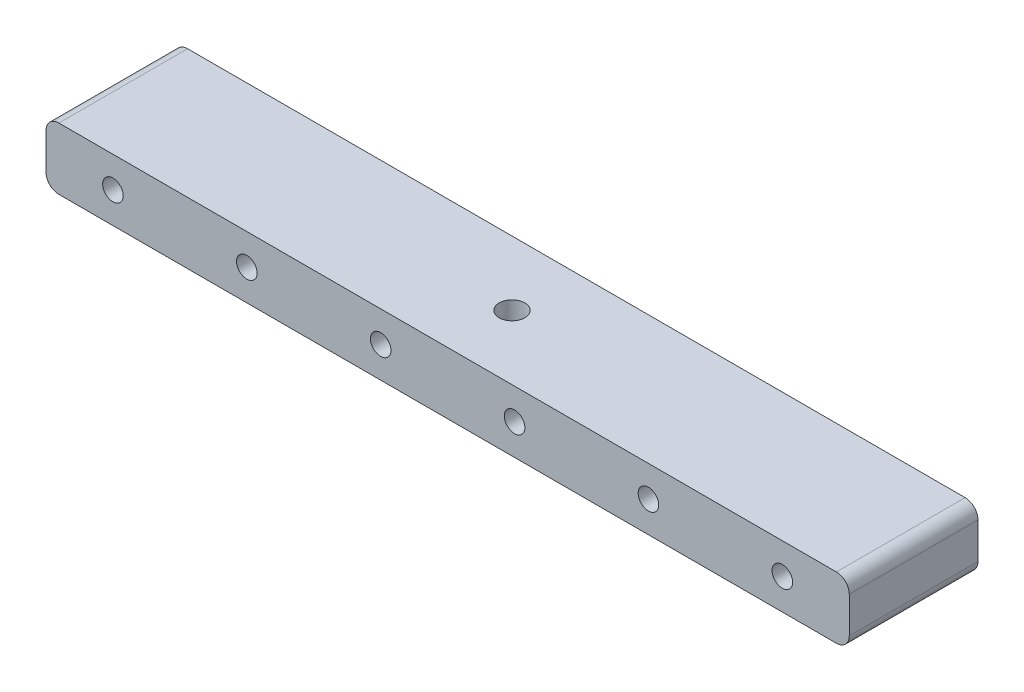
ISO-10303-21;
HEADER;
FILE_DESCRIPTION(('STEP AP214'),'2;1');
FILE_NAME('part.step','',(''),(''),'','','');
FILE_SCHEMA(('AUTOMOTIVE_DESIGN { 1 0 10303 214 1 1 1 1 }'));
ENDSEC;
DATA;
#1=APPLICATION_CONTEXT('core data for automotive mechanical design processes');
#2=APPLICATION_PROTOCOL_DEFINITION('international standard','automotive_design',2000,#1);
#3=PRODUCT_CONTEXT('',#1,'mechanical');
#4=PRODUCT('Part','Part','',(#3));
#5=PRODUCT_RELATED_PRODUCT_CATEGORY('part','',(#4));
#6=PRODUCT_DEFINITION_FORMATION('','',#4);
#7=PRODUCT_DEFINITION_CONTEXT('part definition',#1,'design');
#8=PRODUCT_DEFINITION('design','',#6,#7);
#9=PRODUCT_DEFINITION_SHAPE('','',#8);
#10=(LENGTH_UNIT() NAMED_UNIT(*) SI_UNIT(.MILLI.,.METRE.));
#11=(NAMED_UNIT(*) PLANE_ANGLE_UNIT() SI_UNIT($,.RADIAN.));
#12=(NAMED_UNIT(*) SI_UNIT($,.STERADIAN.) SOLID_ANGLE_UNIT());
#13=UNCERTAINTY_MEASURE_WITH_UNIT(LENGTH_MEASURE(1.E-05),#10,'distance_accuracy_value','');
#14=(GEOMETRIC_REPRESENTATION_CONTEXT(3) GLOBAL_UNCERTAINTY_ASSIGNED_CONTEXT((#13)) GLOBAL_UNIT_ASSIGNED_CONTEXT((#10,
#11,#12)) REPRESENTATION_CONTEXT('',''));
#15=CARTESIAN_POINT('',(0.,0.,0.));
#16=DIRECTION('',(0.,0.,1.));
#17=DIRECTION('',(1.,0.,0.));
#18=AXIS2_PLACEMENT_3D('',#15,#16,#17);
#19=CARTESIAN_POINT('',(65.,0.,2.5));
#20=DIRECTION('',(0.,0.,1.));
#21=DIRECTION('',(1.,0.,0.));
#22=AXIS2_PLACEMENT_3D('',#19,#20,#21);
#23=PLANE('',#22);
#24=CARTESIAN_POINT('',(65.,0.,2.5));
#25=DIRECTION('',(0.,0.,1.));
#26=DIRECTION('',(1.,0.,0.));
#27=AXIS2_PLACEMENT_3D('',#24,#25,#26);
#28=CIRCLE('',#27,2.);
#29=CARTESIAN_POINT('',(67.,0.,2.5));
#30=VERTEX_POINT('',#29);
#31=EDGE_CURVE('E11',#30,#30,#28,.T.);
#32=ORIENTED_EDGE('',*,*,#31,.T.);
#33=EDGE_LOOP('',(#32));
#34=FACE_BOUND('',#33,.T.);
#35=ADVANCED_FACE('F37',(#34),#23,.T.);
#36=CARTESIAN_POINT('',(65.,0.,2.5));
#37=DIRECTION('',(0.,0.,1.));
#38=DIRECTION('',(1.,0.,0.));
#39=AXIS2_PLACEMENT_3D('',#36,#37,#38);
#40=CYLINDRICAL_SURFACE('',#39,2.);
#41=ORIENTED_EDGE('',*,*,#31,.F.);
#42=EDGE_LOOP('',(#41));
#43=FACE_BOUND('',#42,.T.);
#44=CARTESIAN_POINT('',(65.,0.,12.5));
#45=DIRECTION('',(0.,0.,1.));
#46=DIRECTION('',(1.,0.,0.));
#47=AXIS2_PLACEMENT_3D('',#44,#45,#46);
#48=CIRCLE('',#47,2.);
#49=CARTESIAN_POINT('',(67.,0.,12.5));
#50=VERTEX_POINT('',#49);
#51=EDGE_CURVE('E44',#50,#50,#48,.T.);
#52=ORIENTED_EDGE('',*,*,#51,.T.);
#53=EDGE_LOOP('',(#52));
#54=FACE_BOUND('',#53,.T.);
#55=ADVANCED_FACE('F179',(#43,#54),#40,.F.);
#56=CARTESIAN_POINT('',(39.,0.,2.5));
#57=DIRECTION('',(0.,0.,1.));
#58=DIRECTION('',(1.,0.,0.));
#59=AXIS2_PLACEMENT_3D('',#56,#57,#58);
#60=PLANE('',#59);
#61=CARTESIAN_POINT('',(39.,0.,2.5));
#62=DIRECTION('',(0.,0.,1.));
#63=DIRECTION('',(1.,0.,0.));
#64=AXIS2_PLACEMENT_3D('',#61,#62,#63);
#65=CIRCLE('',#64,2.);
#66=CARTESIAN_POINT('',(41.,0.,2.5));
#67=VERTEX_POINT('',#66);
#68=EDGE_CURVE('E174',#67,#67,#65,.T.);
#69=ORIENTED_EDGE('',*,*,#68,.T.);
#70=EDGE_LOOP('',(#69));
#71=FACE_BOUND('',#70,.T.);
#72=ADVANCED_FACE('F202',(#71),#60,.T.);
#73=CARTESIAN_POINT('',(39.,0.,2.5));
#74=DIRECTION('',(0.,0.,1.));
#75=DIRECTION('',(1.,0.,0.));
#76=AXIS2_PLACEMENT_3D('',#73,#74,#75);
#77=CYLINDRICAL_SURFACE('',#76,2.);
#78=ORIENTED_EDGE('',*,*,#68,.F.);
#79=EDGE_LOOP('',(#78));
#80=FACE_BOUND('',#79,.T.);
#81=CARTESIAN_POINT('',(39.,0.,12.5));
#82=DIRECTION('',(0.,0.,1.));
#83=DIRECTION('',(1.,0.,0.));
#84=AXIS2_PLACEMENT_3D('',#81,#82,#83);
#85=CIRCLE('',#84,2.);
#86=CARTESIAN_POINT('',(41.,0.,12.5));
#87=VERTEX_POINT('',#86);
#88=EDGE_CURVE('E171',#87,#87,#85,.T.);
#89=ORIENTED_EDGE('',*,*,#88,.T.);
#90=EDGE_LOOP('',(#89));
#91=FACE_BOUND('',#90,.T.);
#92=ADVANCED_FACE('F208',(#80,#91),#77,.F.);
#93=CARTESIAN_POINT('',(13.,0.,2.5));
#94=DIRECTION('',(0.,0.,1.));
#95=DIRECTION('',(1.,0.,0.));
#96=AXIS2_PLACEMENT_3D('',#93,#94,#95);
#97=PLANE('',#96);
#98=CARTESIAN_POINT('',(13.,0.,2.5));
#99=DIRECTION('',(0.,0.,1.));
#100=DIRECTION('',(1.,0.,0.));
#101=AXIS2_PLACEMENT_3D('',#98,#99,#100);
#102=CIRCLE('',#101,2.);
#103=CARTESIAN_POINT('',(15.,0.,2.5));
#104=VERTEX_POINT('',#103);
#105=EDGE_CURVE('E168',#104,#104,#102,.T.);
#106=ORIENTED_EDGE('',*,*,#105,.T.);
#107=EDGE_LOOP('',(#106));
#108=FACE_BOUND('',#107,.T.);
#109=ADVANCED_FACE('F214',(#108),#97,.T.);
#110=CARTESIAN_POINT('',(13.,0.,2.5));
#111=DIRECTION('',(0.,0.,1.));
#112=DIRECTION('',(1.,0.,0.));
#113=AXIS2_PLACEMENT_3D('',#110,#111,#112);
#114=CYLINDRICAL_SURFACE('',#113,2.);
#115=ORIENTED_EDGE('',*,*,#105,.F.);
#116=EDGE_LOOP('',(#115));
#117=FACE_BOUND('',#116,.T.);
#118=CARTESIAN_POINT('',(13.,0.,12.5));
#119=DIRECTION('',(0.,0.,1.));
#120=DIRECTION('',(1.,0.,0.));
#121=AXIS2_PLACEMENT_3D('',#118,#119,#120);
#122=CIRCLE('',#121,2.);
#123=CARTESIAN_POINT('',(15.,0.,12.5));
#124=VERTEX_POINT('',#123);
#125=EDGE_CURVE('E165',#124,#124,#122,.T.);
#126=ORIENTED_EDGE('',*,*,#125,.T.);
#127=EDGE_LOOP('',(#126));
#128=FACE_BOUND('',#127,.T.);
#129=ADVANCED_FACE('F218',(#117,#128),#114,.F.);
#130=CARTESIAN_POINT('',(-13.,0.,2.5));
#131=DIRECTION('',(0.,0.,1.));
#132=DIRECTION('',(1.,0.,0.));
#133=AXIS2_PLACEMENT_3D('',#130,#131,#132);
#134=PLANE('',#133);
#135=CARTESIAN_POINT('',(-13.,0.,2.5));
#136=DIRECTION('',(0.,0.,1.));
#137=DIRECTION('',(1.,0.,0.));
#138=AXIS2_PLACEMENT_3D('',#135,#136,#137);
#139=CIRCLE('',#138,2.);
#140=CARTESIAN_POINT('',(-11.,0.,2.5));
#141=VERTEX_POINT('',#140);
#142=EDGE_CURVE('E162',#141,#141,#139,.T.);
#143=ORIENTED_EDGE('',*,*,#142,.T.);
#144=EDGE_LOOP('',(#143));
#145=FACE_BOUND('',#144,.T.);
#146=ADVANCED_FACE('F222',(#145),#134,.T.);
#147=CARTESIAN_POINT('',(-13.,0.,2.5));
#148=DIRECTION('',(0.,0.,1.));
#149=DIRECTION('',(1.,0.,0.));
#150=AXIS2_PLACEMENT_3D('',#147,#148,#149);
#151=CYLINDRICAL_SURFACE('',#150,2.);
#152=ORIENTED_EDGE('',*,*,#142,.F.);
#153=EDGE_LOOP('',(#152));
#154=FACE_BOUND('',#153,.T.);
#155=CARTESIAN_POINT('',(-13.,0.,12.5));
#156=DIRECTION('',(0.,0.,1.));
#157=DIRECTION('',(1.,0.,0.));
#158=AXIS2_PLACEMENT_3D('',#155,#156,#157);
#159=CIRCLE('',#158,2.);
#160=CARTESIAN_POINT('',(-11.,0.,12.5));
#161=VERTEX_POINT('',#160);
#162=EDGE_CURVE('E159',#161,#161,#159,.T.);
#163=ORIENTED_EDGE('',*,*,#162,.T.);
#164=EDGE_LOOP('',(#163));
#165=FACE_BOUND('',#164,.T.);
#166=ADVANCED_FACE('F226',(#154,#165),#151,.F.);
#167=CARTESIAN_POINT('',(0.,6.,0.));
#168=DIRECTION('',(0.,1.,0.));
#169=DIRECTION('',(0.,0.,1.));
#170=AXIS2_PLACEMENT_3D('',#167,#168,#169);
#171=PLANE('',#170);
#172=DIRECTION('',(-1.,0.,0.));
#173=VECTOR('',#172,1.);
#174=CARTESIAN_POINT('',(-78.,6.,-12.5));
#175=LINE('',#174,#173);
#176=CARTESIAN_POINT('',(75.5,6.,-12.5));
#177=VERTEX_POINT('',#176);
#178=CARTESIAN_POINT('',(-75.5,6.,-12.5));
#179=VERTEX_POINT('',#178);
#180=EDGE_CURVE('E290',#177,#179,#175,.T.);
#181=ORIENTED_EDGE('',*,*,#180,.T.);
#182=DIRECTION('',(0.,0.,1.));
#183=VECTOR('',#182,1.);
#184=CARTESIAN_POINT('',(-75.5,6.,12.5));
#185=LINE('',#184,#183);
#186=CARTESIAN_POINT('',(-75.5,6.,12.5));
#187=VERTEX_POINT('',#186);
#188=EDGE_CURVE('E153',#179,#187,#185,.T.);
#189=ORIENTED_EDGE('',*,*,#188,.T.);
#190=DIRECTION('',(1.,0.,0.));
#191=VECTOR('',#190,1.);
#192=CARTESIAN_POINT('',(-78.,6.,12.5));
#193=LINE('',#192,#191);
#194=CARTESIAN_POINT('',(75.5,6.,12.5));
#195=VERTEX_POINT('',#194);
#196=EDGE_CURVE('E109',#187,#195,#193,.T.);
#197=ORIENTED_EDGE('',*,*,#196,.T.);
#198=DIRECTION('',(0.,0.,-1.));
#199=VECTOR('',#198,1.);
#200=CARTESIAN_POINT('',(75.5,6.,-12.5));
#201=LINE('',#200,#199);
#202=EDGE_CURVE('E150',#195,#177,#201,.T.);
#203=ORIENTED_EDGE('',*,*,#202,.T.);
#204=EDGE_LOOP('',(#181,#189,#197,#203));
#205=FACE_BOUND('',#204,.T.);
#206=CARTESIAN_POINT('',(0.,6.,0.));
#207=DIRECTION('',(0.,1.,0.));
#208=DIRECTION('',(0.,0.,1.));
#209=AXIS2_PLACEMENT_3D('',#206,#207,#208);
#210=CIRCLE('',#209,2.5);
#211=CARTESIAN_POINT('',(0.,6.,2.5));
#212=VERTEX_POINT('',#211);
#213=EDGE_CURVE('E283',#212,#212,#210,.T.);
#214=ORIENTED_EDGE('',*,*,#213,.F.);
#215=EDGE_LOOP('',(#214));
#216=FACE_BOUND('',#215,.T.);
#217=ADVANCED_FACE('F230',(#205,#216),#171,.T.);
#218=CARTESIAN_POINT('',(0.,-6.,0.));
#219=DIRECTION('',(0.,1.,0.));
#220=DIRECTION('',(0.,0.,1.));
#221=AXIS2_PLACEMENT_3D('',#218,#219,#220);
#222=PLANE('',#221);
#223=DIRECTION('',(1.,0.,0.));
#224=VECTOR('',#223,1.);
#225=CARTESIAN_POINT('',(-78.,-6.,12.5));
#226=LINE('',#225,#224);
#227=CARTESIAN_POINT('',(-75.5,-6.,12.5));
#228=VERTEX_POINT('',#227);
#229=CARTESIAN_POINT('',(75.5,-6.,12.5));
#230=VERTEX_POINT('',#229);
#231=EDGE_CURVE('E282',#228,#230,#226,.T.);
#232=ORIENTED_EDGE('',*,*,#231,.F.);
#233=DIRECTION('',(0.,0.,1.));
#234=VECTOR('',#233,1.);
#235=CARTESIAN_POINT('',(-75.5,-6.,0.));
#236=LINE('',#235,#234);
#237=CARTESIAN_POINT('',(-75.5,-6.,-12.5));
#238=VERTEX_POINT('',#237);
#239=EDGE_CURVE('E143',#228,#238,#236,.F.);
#240=ORIENTED_EDGE('',*,*,#239,.T.);
#241=DIRECTION('',(-1.,0.,0.));
#242=VECTOR('',#241,1.);
#243=CARTESIAN_POINT('',(-78.,-6.,-12.5));
#244=LINE('',#243,#242);
#245=CARTESIAN_POINT('',(75.5,-6.,-12.5));
#246=VERTEX_POINT('',#245);
#247=EDGE_CURVE('E279',#246,#238,#244,.T.);
#248=ORIENTED_EDGE('',*,*,#247,.F.);
#249=DIRECTION('',(0.,0.,-1.));
#250=VECTOR('',#249,1.);
#251=CARTESIAN_POINT('',(75.5,-6.,0.));
#252=LINE('',#251,#250);
#253=EDGE_CURVE('E141',#246,#230,#252,.F.);
#254=ORIENTED_EDGE('',*,*,#253,.T.);
#255=EDGE_LOOP('',(#232,#240,#248,#254));
#256=FACE_BOUND('',#255,.T.);
#257=CARTESIAN_POINT('',(0.,-6.,0.));
#258=DIRECTION('',(0.,1.,0.));
#259=DIRECTION('',(0.,0.,1.));
#260=AXIS2_PLACEMENT_3D('',#257,#258,#259);
#261=CIRCLE('',#260,2.5);
#262=CARTESIAN_POINT('',(0.,-6.,2.5));
#263=VERTEX_POINT('',#262);
#264=EDGE_CURVE('E304',#263,#263,#261,.T.);
#265=ORIENTED_EDGE('',*,*,#264,.T.);
#266=EDGE_LOOP('',(#265));
#267=FACE_BOUND('',#266,.T.);
#268=ADVANCED_FACE('F248',(#256,#267),#222,.F.);
#269=CARTESIAN_POINT('',(78.,6.,-12.5));
#270=DIRECTION('',(-1.,0.,0.));
#271=DIRECTION('',(0.,0.,1.));
#272=AXIS2_PLACEMENT_3D('',#269,#270,#271);
#273=PLANE('',#272);
#274=DIRECTION('',(0.,-1.,0.));
#275=VECTOR('',#274,1.);
#276=CARTESIAN_POINT('',(78.,6.,12.5));
#277=LINE('',#276,#275);
#278=CARTESIAN_POINT('',(78.,3.5,12.5));
#279=VERTEX_POINT('',#278);
#280=CARTESIAN_POINT('',(78.,-3.5,12.5));
#281=VERTEX_POINT('',#280);
#282=EDGE_CURVE('E126',#279,#281,#277,.T.);
#283=ORIENTED_EDGE('',*,*,#282,.T.);
#284=DIRECTION('',(0.,0.,-1.));
#285=VECTOR('',#284,1.);
#286=CARTESIAN_POINT('',(78.,-3.5,-12.5));
#287=LINE('',#286,#285);
#288=CARTESIAN_POINT('',(78.,-3.5,-12.5));
#289=VERTEX_POINT('',#288);
#290=EDGE_CURVE('E157',#281,#289,#287,.T.);
#291=ORIENTED_EDGE('',*,*,#290,.T.);
#292=DIRECTION('',(0.,-1.,0.));
#293=VECTOR('',#292,1.);
#294=CARTESIAN_POINT('',(78.,6.,-12.5));
#295=LINE('',#294,#293);
#296=CARTESIAN_POINT('',(78.,3.5,-12.5));
#297=VERTEX_POINT('',#296);
#298=EDGE_CURVE('E131',#297,#289,#295,.T.);
#299=ORIENTED_EDGE('',*,*,#298,.F.);
#300=DIRECTION('',(0.,0.,-1.));
#301=VECTOR('',#300,1.);
#302=CARTESIAN_POINT('',(78.,3.5,12.5));
#303=LINE('',#302,#301);
#304=EDGE_CURVE('E155',#297,#279,#303,.F.);
#305=ORIENTED_EDGE('',*,*,#304,.T.);
#306=EDGE_LOOP('',(#283,#291,#299,#305));
#307=FACE_BOUND('',#306,.T.);
#308=ADVANCED_FACE('F245',(#307),#273,.F.);
#309=CARTESIAN_POINT('',(-78.,6.,-12.5));
#310=DIRECTION('',(0.,0.,1.));
#311=DIRECTION('',(1.,0.,0.));
#312=AXIS2_PLACEMENT_3D('',#309,#310,#311);
#313=PLANE('',#312);
#314=CARTESIAN_POINT('',(-65.,0.,-12.5));
#315=DIRECTION('',(0.,0.,1.));
#316=DIRECTION('',(1.,0.,0.));
#317=AXIS2_PLACEMENT_3D('',#314,#315,#316);
#318=CIRCLE('',#317,2.);
#319=CARTESIAN_POINT('',(-63.,0.,-12.5));
#320=VERTEX_POINT('',#319);
#321=EDGE_CURVE('E257',#320,#320,#318,.T.);
#322=ORIENTED_EDGE('',*,*,#321,.T.);
#323=EDGE_LOOP('',(#322));
#324=FACE_BOUND('',#323,.T.);
#325=CARTESIAN_POINT('',(-39.,0.,-12.5));
#326=DIRECTION('',(0.,0.,1.));
#327=DIRECTION('',(1.,0.,0.));
#328=AXIS2_PLACEMENT_3D('',#325,#326,#327);
#329=CIRCLE('',#328,2.);
#330=CARTESIAN_POINT('',(-37.,0.,-12.5));
#331=VERTEX_POINT('',#330);
#332=EDGE_CURVE('E261',#331,#331,#329,.T.);
#333=ORIENTED_EDGE('',*,*,#332,.T.);
#334=EDGE_LOOP('',(#333));
#335=FACE_BOUND('',#334,.T.);
#336=CARTESIAN_POINT('',(-13.,0.,-12.5));
#337=DIRECTION('',(0.,0.,1.));
#338=DIRECTION('',(1.,0.,0.));
#339=AXIS2_PLACEMENT_3D('',#336,#337,#338);
#340=CIRCLE('',#339,2.);
#341=CARTESIAN_POINT('',(-11.,0.,-12.5));
#342=VERTEX_POINT('',#341);
#343=EDGE_CURVE('E265',#342,#342,#340,.T.);
#344=ORIENTED_EDGE('',*,*,#343,.T.);
#345=EDGE_LOOP('',(#344));
#346=FACE_BOUND('',#345,.T.);
#347=CARTESIAN_POINT('',(13.,0.,-12.5));
#348=DIRECTION('',(0.,0.,1.));
#349=DIRECTION('',(1.,0.,0.));
#350=AXIS2_PLACEMENT_3D('',#347,#348,#349);
#351=CIRCLE('',#350,2.);
#352=CARTESIAN_POINT('',(15.,0.,-12.5));
#353=VERTEX_POINT('',#352);
#354=EDGE_CURVE('E269',#353,#353,#351,.T.);
#355=ORIENTED_EDGE('',*,*,#354,.T.);
#356=EDGE_LOOP('',(#355));
#357=FACE_BOUND('',#356,.T.);
#358=CARTESIAN_POINT('',(39.,0.,-12.5));
#359=DIRECTION('',(0.,0.,1.));
#360=DIRECTION('',(1.,0.,0.));
#361=AXIS2_PLACEMENT_3D('',#358,#359,#360);
#362=CIRCLE('',#361,2.);
#363=CARTESIAN_POINT('',(41.,0.,-12.5));
#364=VERTEX_POINT('',#363);
#365=EDGE_CURVE('E273',#364,#364,#362,.T.);
#366=ORIENTED_EDGE('',*,*,#365,.T.);
#367=EDGE_LOOP('',(#366));
#368=FACE_BOUND('',#367,.T.);
#369=CARTESIAN_POINT('',(65.,0.,-12.5));
#370=DIRECTION('',(0.,0.,1.));
#371=DIRECTION('',(1.,0.,0.));
#372=AXIS2_PLACEMENT_3D('',#369,#370,#371);
#373=CIRCLE('',#372,2.);
#374=CARTESIAN_POINT('',(67.,0.,-12.5));
#375=VERTEX_POINT('',#374);
#376=EDGE_CURVE('E276',#375,#375,#373,.T.);
#377=ORIENTED_EDGE('',*,*,#376,.T.);
#378=EDGE_LOOP('',(#377));
#379=FACE_BOUND('',#378,.T.);
#380=ORIENTED_EDGE('',*,*,#247,.T.);
#381=CARTESIAN_POINT('',(-75.5,-3.5,-12.5));
#382=DIRECTION('',(0.,0.,1.));
#383=DIRECTION('',(1.,0.,0.));
#384=AXIS2_PLACEMENT_3D('',#381,#382,#383);
#385=CIRCLE('',#384,2.5);
#386=CARTESIAN_POINT('',(-78.,-3.5,-12.5));
#387=VERTEX_POINT('',#386);
#388=EDGE_CURVE('E148',#238,#387,#385,.F.);
#389=ORIENTED_EDGE('',*,*,#388,.T.);
#390=DIRECTION('',(0.,-1.,0.));
#391=VECTOR('',#390,1.);
#392=CARTESIAN_POINT('',(-78.,6.,-12.5));
#393=LINE('',#392,#391);
#394=CARTESIAN_POINT('',(-78.,3.5,-12.5));
#395=VERTEX_POINT('',#394);
#396=EDGE_CURVE('E125',#395,#387,#393,.T.);
#397=ORIENTED_EDGE('',*,*,#396,.F.);
#398=CARTESIAN_POINT('',(-75.5,3.5,-12.5));
#399=DIRECTION('',(0.,0.,1.));
#400=DIRECTION('',(1.,0.,0.));
#401=AXIS2_PLACEMENT_3D('',#398,#399,#400);
#402=CIRCLE('',#401,2.5);
#403=EDGE_CURVE('E130',#395,#179,#402,.F.);
#404=ORIENTED_EDGE('',*,*,#403,.T.);
#405=ORIENTED_EDGE('',*,*,#180,.F.);
#406=CARTESIAN_POINT('',(75.5,3.5,-12.5));
#407=DIRECTION('',(0.,0.,1.));
#408=DIRECTION('',(1.,0.,0.));
#409=AXIS2_PLACEMENT_3D('',#406,#407,#408);
#410=CIRCLE('',#409,2.5);
#411=EDGE_CURVE('E59',#177,#297,#410,.F.);
#412=ORIENTED_EDGE('',*,*,#411,.T.);
#413=ORIENTED_EDGE('',*,*,#298,.T.);
#414=CARTESIAN_POINT('',(75.5,-3.5,-12.5));
#415=DIRECTION('',(0.,0.,1.));
#416=DIRECTION('',(1.,0.,0.));
#417=AXIS2_PLACEMENT_3D('',#414,#415,#416);
#418=CIRCLE('',#417,2.5);
#419=EDGE_CURVE('E51',#289,#246,#418,.F.);
#420=ORIENTED_EDGE('',*,*,#419,.T.);
#421=EDGE_LOOP('',(#380,#389,#397,#404,#405,#412,#413,#420));
#422=FACE_BOUND('',#421,.T.);
#423=ADVANCED_FACE('F192',(#324,#335,#346,#357,#368,#379,#422),#313,.F.);
#424=CARTESIAN_POINT('',(-78.,6.,-12.5));
#425=DIRECTION('',(1.,0.,0.));
#426=DIRECTION('',(0.,0.,-1.));
#427=AXIS2_PLACEMENT_3D('',#424,#425,#426);
#428=PLANE('',#427);
#429=ORIENTED_EDGE('',*,*,#396,.T.);
#430=DIRECTION('',(0.,0.,1.));
#431=VECTOR('',#430,1.);
#432=CARTESIAN_POINT('',(-78.,-3.5,-12.5));
#433=LINE('',#432,#431);
#434=CARTESIAN_POINT('',(-78.,-3.5,12.5));
#435=VERTEX_POINT('',#434);
#436=EDGE_CURVE('E124',#387,#435,#433,.T.);
#437=ORIENTED_EDGE('',*,*,#436,.T.);
#438=DIRECTION('',(0.,-1.,0.));
#439=VECTOR('',#438,1.);
#440=CARTESIAN_POINT('',(-78.,6.,12.5));
#441=LINE('',#440,#439);
#442=CARTESIAN_POINT('',(-78.,3.5,12.5));
#443=VERTEX_POINT('',#442);
#444=EDGE_CURVE('E107',#443,#435,#441,.T.);
#445=ORIENTED_EDGE('',*,*,#444,.F.);
#446=DIRECTION('',(0.,0.,1.));
#447=VECTOR('',#446,1.);
#448=CARTESIAN_POINT('',(-78.,3.5,-12.5));
#449=LINE('',#448,#447);
#450=EDGE_CURVE('E121',#443,#395,#449,.F.);
#451=ORIENTED_EDGE('',*,*,#450,.T.);
#452=EDGE_LOOP('',(#429,#437,#445,#451));
#453=FACE_BOUND('',#452,.T.);
#454=ADVANCED_FACE('F120',(#453),#428,.F.);
#455=CARTESIAN_POINT('',(-78.,6.,12.5));
#456=DIRECTION('',(0.,0.,-1.));
#457=DIRECTION('',(-1.,0.,0.));
#458=AXIS2_PLACEMENT_3D('',#455,#456,#457);
#459=PLANE('',#458);
#460=CARTESIAN_POINT('',(-39.,0.,12.5));
#461=DIRECTION('',(0.,0.,1.));
#462=DIRECTION('',(1.,0.,0.));
#463=AXIS2_PLACEMENT_3D('',#460,#461,#462);
#464=CIRCLE('',#463,2.);
#465=CARTESIAN_POINT('',(-37.,0.,12.5));
#466=VERTEX_POINT('',#465);
#467=EDGE_CURVE('E318',#466,#466,#464,.T.);
#468=ORIENTED_EDGE('',*,*,#467,.F.);
#469=EDGE_LOOP('',(#468));
#470=FACE_BOUND('',#469,.T.);
#471=CARTESIAN_POINT('',(-65.,0.,12.5));
#472=DIRECTION('',(0.,0.,1.));
#473=DIRECTION('',(1.,0.,0.));
#474=AXIS2_PLACEMENT_3D('',#471,#472,#473);
#475=CIRCLE('',#474,2.);
#476=CARTESIAN_POINT('',(-63.,0.,12.5));
#477=VERTEX_POINT('',#476);
#478=EDGE_CURVE('E310',#477,#477,#475,.T.);
#479=ORIENTED_EDGE('',*,*,#478,.F.);
#480=EDGE_LOOP('',(#479));
#481=FACE_BOUND('',#480,.T.);
#482=ORIENTED_EDGE('',*,*,#444,.T.);
#483=CARTESIAN_POINT('',(-75.5,-3.5,12.5));
#484=DIRECTION('',(0.,0.,-1.));
#485=DIRECTION('',(-1.,0.,0.));
#486=AXIS2_PLACEMENT_3D('',#483,#484,#485);
#487=CIRCLE('',#486,2.5);
#488=EDGE_CURVE('E114',#435,#228,#487,.F.);
#489=ORIENTED_EDGE('',*,*,#488,.T.);
#490=ORIENTED_EDGE('',*,*,#231,.T.);
#491=CARTESIAN_POINT('',(75.5,-3.5,12.5));
#492=DIRECTION('',(0.,0.,-1.));
#493=DIRECTION('',(-1.,0.,0.));
#494=AXIS2_PLACEMENT_3D('',#491,#492,#493);
#495=CIRCLE('',#494,2.5);
#496=EDGE_CURVE('E115',#230,#281,#495,.F.);
#497=ORIENTED_EDGE('',*,*,#496,.T.);
#498=ORIENTED_EDGE('',*,*,#282,.F.);
#499=CARTESIAN_POINT('',(75.5,3.5,12.5));
#500=DIRECTION('',(0.,0.,-1.));
#501=DIRECTION('',(-1.,0.,0.));
#502=AXIS2_PLACEMENT_3D('',#499,#500,#501);
#503=CIRCLE('',#502,2.5);
#504=EDGE_CURVE('E133',#279,#195,#503,.F.);
#505=ORIENTED_EDGE('',*,*,#504,.T.);
#506=ORIENTED_EDGE('',*,*,#196,.F.);
#507=CARTESIAN_POINT('',(-75.5,3.5,12.5));
#508=DIRECTION('',(0.,0.,-1.));
#509=DIRECTION('',(-1.,0.,0.));
#510=AXIS2_PLACEMENT_3D('',#507,#508,#509);
#511=CIRCLE('',#510,2.5);
#512=EDGE_CURVE('E103',#187,#443,#511,.F.);
#513=ORIENTED_EDGE('',*,*,#512,.T.);
#514=EDGE_LOOP('',(#482,#489,#490,#497,#498,#505,#506,#513));
#515=FACE_BOUND('',#514,.T.);
#516=ORIENTED_EDGE('',*,*,#162,.F.);
#517=EDGE_LOOP('',(#516));
#518=FACE_BOUND('',#517,.T.);
#519=ORIENTED_EDGE('',*,*,#125,.F.);
#520=EDGE_LOOP('',(#519));
#521=FACE_BOUND('',#520,.T.);
#522=ORIENTED_EDGE('',*,*,#88,.F.);
#523=EDGE_LOOP('',(#522));
#524=FACE_BOUND('',#523,.T.);
#525=ORIENTED_EDGE('',*,*,#51,.F.);
#526=EDGE_LOOP('',(#525));
#527=FACE_BOUND('',#526,.T.);
#528=ADVANCED_FACE('F105',(#470,#481,#515,#518,#521,#524,#527),#459,.F.);
#529=CARTESIAN_POINT('',(0.,6.,0.));
#530=DIRECTION('',(0.,-1.,0.));
#531=DIRECTION('',(0.,0.,-1.));
#532=AXIS2_PLACEMENT_3D('',#529,#530,#531);
#533=CYLINDRICAL_SURFACE('',#532,2.5);
#534=ORIENTED_EDGE('',*,*,#213,.T.);
#535=EDGE_LOOP('',(#534));
#536=FACE_BOUND('',#535,.T.);
#537=ORIENTED_EDGE('',*,*,#264,.F.);
#538=EDGE_LOOP('',(#537));
#539=FACE_BOUND('',#538,.T.);
#540=ADVANCED_FACE('F182',(#536,#539),#533,.F.);
#541=CARTESIAN_POINT('',(-75.5,-3.5,-12.5));
#542=DIRECTION('',(0.,0.,1.));
#543=DIRECTION('',(1.,0.,0.));
#544=AXIS2_PLACEMENT_3D('',#541,#542,#543);
#545=CYLINDRICAL_SURFACE('',#544,2.5);
#546=ORIENTED_EDGE('',*,*,#388,.F.);
#547=ORIENTED_EDGE('',*,*,#239,.F.);
#548=ORIENTED_EDGE('',*,*,#488,.F.);
#549=ORIENTED_EDGE('',*,*,#436,.F.);
#550=EDGE_LOOP('',(#546,#547,#548,#549));
#551=FACE_BOUND('',#550,.T.);
#552=ADVANCED_FACE('F189',(#551),#545,.T.);
#553=CARTESIAN_POINT('',(-75.5,3.5,0.));
#554=DIRECTION('',(0.,0.,-1.));
#555=DIRECTION('',(-1.,0.,0.));
#556=AXIS2_PLACEMENT_3D('',#553,#554,#555);
#557=CYLINDRICAL_SURFACE('',#556,2.5);
#558=ORIENTED_EDGE('',*,*,#403,.F.);
#559=ORIENTED_EDGE('',*,*,#450,.F.);
#560=ORIENTED_EDGE('',*,*,#512,.F.);
#561=ORIENTED_EDGE('',*,*,#188,.F.);
#562=EDGE_LOOP('',(#558,#559,#560,#561));
#563=FACE_BOUND('',#562,.T.);
#564=ADVANCED_FACE('F129',(#563),#557,.T.);
#565=CARTESIAN_POINT('',(75.5,-3.5,-12.5));
#566=DIRECTION('',(0.,0.,-1.));
#567=DIRECTION('',(-1.,0.,0.));
#568=AXIS2_PLACEMENT_3D('',#565,#566,#567);
#569=CYLINDRICAL_SURFACE('',#568,2.5);
#570=ORIENTED_EDGE('',*,*,#496,.F.);
#571=ORIENTED_EDGE('',*,*,#253,.F.);
#572=ORIENTED_EDGE('',*,*,#419,.F.);
#573=ORIENTED_EDGE('',*,*,#290,.F.);
#574=EDGE_LOOP('',(#570,#571,#572,#573));
#575=FACE_BOUND('',#574,.T.);
#576=ADVANCED_FACE('F236',(#575),#569,.T.);
#577=CARTESIAN_POINT('',(75.5,3.5,0.));
#578=DIRECTION('',(0.,0.,1.));
#579=DIRECTION('',(1.,0.,0.));
#580=AXIS2_PLACEMENT_3D('',#577,#578,#579);
#581=CYLINDRICAL_SURFACE('',#580,2.5);
#582=ORIENTED_EDGE('',*,*,#504,.F.);
#583=ORIENTED_EDGE('',*,*,#304,.F.);
#584=ORIENTED_EDGE('',*,*,#411,.F.);
#585=ORIENTED_EDGE('',*,*,#202,.F.);
#586=EDGE_LOOP('',(#582,#583,#584,#585));
#587=FACE_BOUND('',#586,.T.);
#588=ADVANCED_FACE('F232',(#587),#581,.T.);
#589=CARTESIAN_POINT('',(-65.,0.,2.5));
#590=DIRECTION('',(0.,0.,1.));
#591=DIRECTION('',(1.,0.,0.));
#592=AXIS2_PLACEMENT_3D('',#589,#590,#591);
#593=CYLINDRICAL_SURFACE('',#592,2.);
#594=CARTESIAN_POINT('',(-65.,0.,2.5));
#595=DIRECTION('',(0.,0.,1.));
#596=DIRECTION('',(1.,0.,0.));
#597=AXIS2_PLACEMENT_3D('',#594,#595,#596);
#598=CIRCLE('',#597,2.);
#599=CARTESIAN_POINT('',(-63.,0.,2.5));
#600=VERTEX_POINT('',#599);
#601=EDGE_CURVE('E307',#600,#600,#598,.T.);
#602=ORIENTED_EDGE('',*,*,#601,.F.);
#603=EDGE_LOOP('',(#602));
#604=FACE_BOUND('',#603,.T.);
#605=ORIENTED_EDGE('',*,*,#478,.T.);
#606=EDGE_LOOP('',(#605));
#607=FACE_BOUND('',#606,.T.);
#608=ADVANCED_FACE('F235',(#604,#607),#593,.F.);
#609=CARTESIAN_POINT('',(-65.,0.,2.5));
#610=DIRECTION('',(0.,0.,1.));
#611=DIRECTION('',(1.,0.,0.));
#612=AXIS2_PLACEMENT_3D('',#609,#610,#611);
#613=PLANE('',#612);
#614=ORIENTED_EDGE('',*,*,#601,.T.);
#615=EDGE_LOOP('',(#614));
#616=FACE_BOUND('',#615,.T.);
#617=ADVANCED_FACE('F404',(#616),#613,.T.);
#618=CARTESIAN_POINT('',(-39.,0.,2.5));
#619=DIRECTION('',(0.,0.,1.));
#620=DIRECTION('',(1.,0.,0.));
#621=AXIS2_PLACEMENT_3D('',#618,#619,#620);
#622=CYLINDRICAL_SURFACE('',#621,2.);
#623=CARTESIAN_POINT('',(-39.,0.,2.5));
#624=DIRECTION('',(0.,0.,1.));
#625=DIRECTION('',(1.,0.,0.));
#626=AXIS2_PLACEMENT_3D('',#623,#624,#625);
#627=CIRCLE('',#626,2.);
#628=CARTESIAN_POINT('',(-37.,0.,2.5));
#629=VERTEX_POINT('',#628);
#630=EDGE_CURVE('E313',#629,#629,#627,.T.);
#631=ORIENTED_EDGE('',*,*,#630,.F.);
#632=EDGE_LOOP('',(#631));
#633=FACE_BOUND('',#632,.T.);
#634=ORIENTED_EDGE('',*,*,#467,.T.);
#635=EDGE_LOOP('',(#634));
#636=FACE_BOUND('',#635,.T.);
#637=ADVANCED_FACE('F400',(#633,#636),#622,.F.);
#638=CARTESIAN_POINT('',(-39.,0.,2.5));
#639=DIRECTION('',(0.,0.,1.));
#640=DIRECTION('',(1.,0.,0.));
#641=AXIS2_PLACEMENT_3D('',#638,#639,#640);
#642=PLANE('',#641);
#643=ORIENTED_EDGE('',*,*,#630,.T.);
#644=EDGE_LOOP('',(#643));
#645=FACE_BOUND('',#644,.T.);
#646=ADVANCED_FACE('F396',(#645),#642,.T.);
#647=CARTESIAN_POINT('',(65.,0.,-2.5));
#648=DIRECTION('',(0.,0.,-1.));
#649=DIRECTION('',(-1.,0.,0.));
#650=AXIS2_PLACEMENT_3D('',#647,#648,#649);
#651=CYLINDRICAL_SURFACE('',#650,2.);
#652=CARTESIAN_POINT('',(65.,0.,-2.5));
#653=DIRECTION('',(0.,0.,1.));
#654=DIRECTION('',(1.,0.,0.));
#655=AXIS2_PLACEMENT_3D('',#652,#653,#654);
#656=CIRCLE('',#655,2.);
#657=CARTESIAN_POINT('',(67.,0.,-2.5));
#658=VERTEX_POINT('',#657);
#659=EDGE_CURVE('E323',#658,#658,#656,.T.);
#660=ORIENTED_EDGE('',*,*,#659,.T.);
#661=EDGE_LOOP('',(#660));
#662=FACE_BOUND('',#661,.T.);
#663=ORIENTED_EDGE('',*,*,#376,.F.);
#664=EDGE_LOOP('',(#663));
#665=FACE_BOUND('',#664,.T.);
#666=ADVANCED_FACE('F392',(#662,#665),#651,.F.);
#667=CARTESIAN_POINT('',(65.,0.,-2.5));
#668=DIRECTION('',(0.,0.,-1.));
#669=DIRECTION('',(1.,0.,0.));
#670=AXIS2_PLACEMENT_3D('',#667,#668,#669);
#671=PLANE('',#670);
#672=ORIENTED_EDGE('',*,*,#659,.F.);
#673=EDGE_LOOP('',(#672));
#674=FACE_BOUND('',#673,.T.);
#675=ADVANCED_FACE('F388',(#674),#671,.T.);
#676=CARTESIAN_POINT('',(39.,0.,-2.5));
#677=DIRECTION('',(0.,0.,-1.));
#678=DIRECTION('',(-1.,0.,0.));
#679=AXIS2_PLACEMENT_3D('',#676,#677,#678);
#680=CYLINDRICAL_SURFACE('',#679,2.);
#681=CARTESIAN_POINT('',(39.,0.,-2.5));
#682=DIRECTION('',(0.,0.,1.));
#683=DIRECTION('',(1.,0.,0.));
#684=AXIS2_PLACEMENT_3D('',#681,#682,#683);
#685=CIRCLE('',#684,2.);
#686=CARTESIAN_POINT('',(41.,0.,-2.5));
#687=VERTEX_POINT('',#686);
#688=EDGE_CURVE('E327',#687,#687,#685,.T.);
#689=ORIENTED_EDGE('',*,*,#688,.T.);
#690=EDGE_LOOP('',(#689));
#691=FACE_BOUND('',#690,.T.);
#692=ORIENTED_EDGE('',*,*,#365,.F.);
#693=EDGE_LOOP('',(#692));
#694=FACE_BOUND('',#693,.T.);
#695=ADVANCED_FACE('F384',(#691,#694),#680,.F.);
#696=CARTESIAN_POINT('',(39.,0.,-2.5));
#697=DIRECTION('',(0.,0.,-1.));
#698=DIRECTION('',(1.,0.,0.));
#699=AXIS2_PLACEMENT_3D('',#696,#697,#698);
#700=PLANE('',#699);
#701=ORIENTED_EDGE('',*,*,#688,.F.);
#702=EDGE_LOOP('',(#701));
#703=FACE_BOUND('',#702,.T.);
#704=ADVANCED_FACE('F380',(#703),#700,.T.);
#705=CARTESIAN_POINT('',(13.,0.,-2.5));
#706=DIRECTION('',(0.,0.,-1.));
#707=DIRECTION('',(-1.,0.,0.));
#708=AXIS2_PLACEMENT_3D('',#705,#706,#707);
#709=CYLINDRICAL_SURFACE('',#708,2.);
#710=CARTESIAN_POINT('',(13.,0.,-2.5));
#711=DIRECTION('',(0.,0.,1.));
#712=DIRECTION('',(1.,0.,0.));
#713=AXIS2_PLACEMENT_3D('',#710,#711,#712);
#714=CIRCLE('',#713,2.);
#715=CARTESIAN_POINT('',(15.,0.,-2.5));
#716=VERTEX_POINT('',#715);
#717=EDGE_CURVE('E331',#716,#716,#714,.T.);
#718=ORIENTED_EDGE('',*,*,#717,.T.);
#719=EDGE_LOOP('',(#718));
#720=FACE_BOUND('',#719,.T.);
#721=ORIENTED_EDGE('',*,*,#354,.F.);
#722=EDGE_LOOP('',(#721));
#723=FACE_BOUND('',#722,.T.);
#724=ADVANCED_FACE('F376',(#720,#723),#709,.F.);
#725=CARTESIAN_POINT('',(13.,0.,-2.5));
#726=DIRECTION('',(0.,0.,-1.));
#727=DIRECTION('',(1.,0.,0.));
#728=AXIS2_PLACEMENT_3D('',#725,#726,#727);
#729=PLANE('',#728);
#730=ORIENTED_EDGE('',*,*,#717,.F.);
#731=EDGE_LOOP('',(#730));
#732=FACE_BOUND('',#731,.T.);
#733=ADVANCED_FACE('F372',(#732),#729,.T.);
#734=CARTESIAN_POINT('',(-13.,0.,-2.5));
#735=DIRECTION('',(0.,0.,-1.));
#736=DIRECTION('',(-1.,0.,0.));
#737=AXIS2_PLACEMENT_3D('',#734,#735,#736);
#738=CYLINDRICAL_SURFACE('',#737,2.);
#739=CARTESIAN_POINT('',(-13.,0.,-2.5));
#740=DIRECTION('',(0.,0.,1.));
#741=DIRECTION('',(1.,0.,0.));
#742=AXIS2_PLACEMENT_3D('',#739,#740,#741);
#743=CIRCLE('',#742,2.);
#744=CARTESIAN_POINT('',(-11.,0.,-2.5));
#745=VERTEX_POINT('',#744);
#746=EDGE_CURVE('E335',#745,#745,#743,.T.);
#747=ORIENTED_EDGE('',*,*,#746,.T.);
#748=EDGE_LOOP('',(#747));
#749=FACE_BOUND('',#748,.T.);
#750=ORIENTED_EDGE('',*,*,#343,.F.);
#751=EDGE_LOOP('',(#750));
#752=FACE_BOUND('',#751,.T.);
#753=ADVANCED_FACE('F368',(#749,#752),#738,.F.);
#754=CARTESIAN_POINT('',(-13.,0.,-2.5));
#755=DIRECTION('',(0.,0.,-1.));
#756=DIRECTION('',(1.,0.,0.));
#757=AXIS2_PLACEMENT_3D('',#754,#755,#756);
#758=PLANE('',#757);
#759=ORIENTED_EDGE('',*,*,#746,.F.);
#760=EDGE_LOOP('',(#759));
#761=FACE_BOUND('',#760,.T.);
#762=ADVANCED_FACE('F364',(#761),#758,.T.);
#763=CARTESIAN_POINT('',(-39.,0.,-2.5));
#764=DIRECTION('',(0.,0.,-1.));
#765=DIRECTION('',(-1.,0.,0.));
#766=AXIS2_PLACEMENT_3D('',#763,#764,#765);
#767=CYLINDRICAL_SURFACE('',#766,2.);
#768=CARTESIAN_POINT('',(-39.,0.,-2.5));
#769=DIRECTION('',(0.,0.,1.));
#770=DIRECTION('',(1.,0.,0.));
#771=AXIS2_PLACEMENT_3D('',#768,#769,#770);
#772=CIRCLE('',#771,2.);
#773=CARTESIAN_POINT('',(-37.,0.,-2.5));
#774=VERTEX_POINT('',#773);
#775=EDGE_CURVE('E339',#774,#774,#772,.T.);
#776=ORIENTED_EDGE('',*,*,#775,.T.);
#777=EDGE_LOOP('',(#776));
#778=FACE_BOUND('',#777,.T.);
#779=ORIENTED_EDGE('',*,*,#332,.F.);
#780=EDGE_LOOP('',(#779));
#781=FACE_BOUND('',#780,.T.);
#782=ADVANCED_FACE('F360',(#778,#781),#767,.F.);
#783=CARTESIAN_POINT('',(-39.,0.,-2.5));
#784=DIRECTION('',(0.,0.,-1.));
#785=DIRECTION('',(1.,0.,0.));
#786=AXIS2_PLACEMENT_3D('',#783,#784,#785);
#787=PLANE('',#786);
#788=ORIENTED_EDGE('',*,*,#775,.F.);
#789=EDGE_LOOP('',(#788));
#790=FACE_BOUND('',#789,.T.);
#791=ADVANCED_FACE('F355',(#790),#787,.T.);
#792=CARTESIAN_POINT('',(-65.,0.,-2.5));
#793=DIRECTION('',(0.,0.,-1.));
#794=DIRECTION('',(-1.,0.,0.));
#795=AXIS2_PLACEMENT_3D('',#792,#793,#794);
#796=CYLINDRICAL_SURFACE('',#795,2.);
#797=CARTESIAN_POINT('',(-65.,0.,-2.5));
#798=DIRECTION('',(0.,0.,1.));
#799=DIRECTION('',(1.,0.,0.));
#800=AXIS2_PLACEMENT_3D('',#797,#798,#799);
#801=CIRCLE('',#800,2.);
#802=CARTESIAN_POINT('',(-63.,0.,-2.5));
#803=VERTEX_POINT('',#802);
#804=EDGE_CURVE('E321',#803,#803,#801,.T.);
#805=ORIENTED_EDGE('',*,*,#804,.T.);
#806=EDGE_LOOP('',(#805));
#807=FACE_BOUND('',#806,.T.);
#808=ORIENTED_EDGE('',*,*,#321,.F.);
#809=EDGE_LOOP('',(#808));
#810=FACE_BOUND('',#809,.T.);
#811=ADVANCED_FACE('F346',(#807,#810),#796,.F.);
#812=CARTESIAN_POINT('',(-65.,0.,-2.5));
#813=DIRECTION('',(0.,0.,-1.));
#814=DIRECTION('',(1.,0.,0.));
#815=AXIS2_PLACEMENT_3D('',#812,#813,#814);
#816=PLANE('',#815);
#817=ORIENTED_EDGE('',*,*,#804,.F.);
#818=EDGE_LOOP('',(#817));
#819=FACE_BOUND('',#818,.T.);
#820=ADVANCED_FACE('F349',(#819),#816,.T.);
#821=CLOSED_SHELL('',(#35,#55,#72,#92,#109,#129,#146,#166,#217,#268,#308,#423,#454,#528,#540,
#552,#564,#576,#588,#608,#617,#637,#646,#666,#675,#695,#704,#724,#733,#753,#762,#782,#791,#811,#820));
#822=MANIFOLD_SOLID_BREP('B2',#821);
#823=ADVANCED_BREP_SHAPE_REPRESENTATION('',(#18,#822),#14);
#824=SHAPE_DEFINITION_REPRESENTATION(#9,#823);
ENDSEC;
END-ISO-10303-21;
